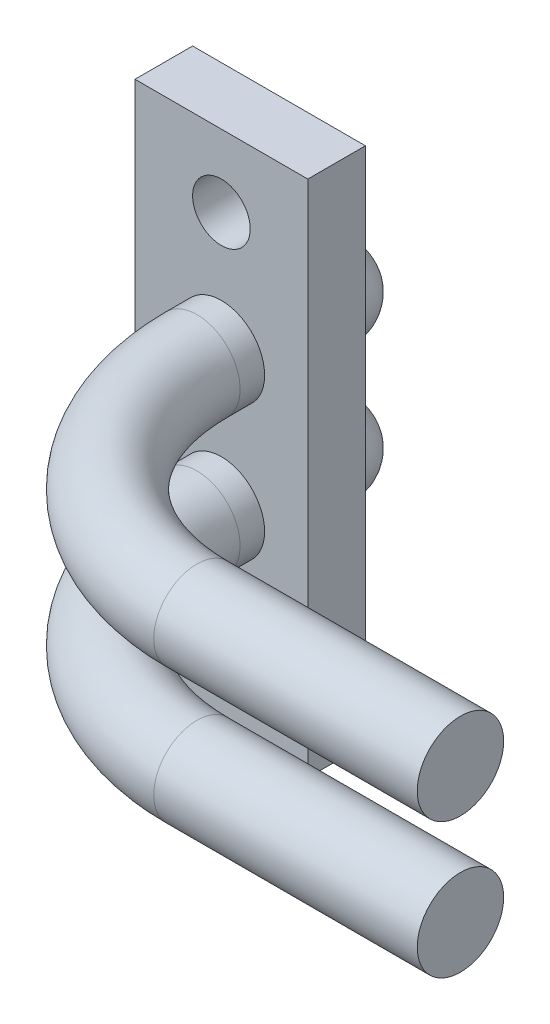
ISO-10303-21;
HEADER;
FILE_DESCRIPTION(('STEP AP214'),'2;1');
FILE_NAME('part.step','',(''),(''),'','','');
FILE_SCHEMA(('AUTOMOTIVE_DESIGN { 1 0 10303 214 1 1 1 1 }'));
ENDSEC;
DATA;
#1=APPLICATION_CONTEXT('core data for automotive mechanical design processes');
#2=APPLICATION_PROTOCOL_DEFINITION('international standard','automotive_design',2000,#1);
#3=PRODUCT_CONTEXT('',#1,'mechanical');
#4=PRODUCT('Part','Part','',(#3));
#5=PRODUCT_RELATED_PRODUCT_CATEGORY('part','',(#4));
#6=PRODUCT_DEFINITION_FORMATION('','',#4);
#7=PRODUCT_DEFINITION_CONTEXT('part definition',#1,'design');
#8=PRODUCT_DEFINITION('design','',#6,#7);
#9=PRODUCT_DEFINITION_SHAPE('','',#8);
#10=(LENGTH_UNIT() NAMED_UNIT(*) SI_UNIT(.MILLI.,.METRE.));
#11=(NAMED_UNIT(*) PLANE_ANGLE_UNIT() SI_UNIT($,.RADIAN.));
#12=(NAMED_UNIT(*) SI_UNIT($,.STERADIAN.) SOLID_ANGLE_UNIT());
#13=UNCERTAINTY_MEASURE_WITH_UNIT(LENGTH_MEASURE(1.E-05),#10,'distance_accuracy_value','');
#14=(GEOMETRIC_REPRESENTATION_CONTEXT(3) GLOBAL_UNCERTAINTY_ASSIGNED_CONTEXT((#13)) GLOBAL_UNIT_ASSIGNED_CONTEXT((#10,
#11,#12)) REPRESENTATION_CONTEXT('',''));
#15=CARTESIAN_POINT('',(0.,0.,0.));
#16=DIRECTION('',(0.,0.,1.));
#17=DIRECTION('',(1.,0.,0.));
#18=AXIS2_PLACEMENT_3D('',#15,#16,#17);
#19=CARTESIAN_POINT('',(3.,9.,2.));
#20=DIRECTION('',(0.,0.,-1.));
#21=DIRECTION('',(-1.,0.,0.));
#22=AXIS2_PLACEMENT_3D('',#19,#20,#21);
#23=PLANE('',#22);
#24=CARTESIAN_POINT('',(0.,-6.5,2.));
#25=DIRECTION('',(0.,0.,1.));
#26=DIRECTION('',(-1.,0.,0.));
#27=AXIS2_PLACEMENT_3D('',#24,#25,#26);
#28=CIRCLE('',#27,1.);
#29=CARTESIAN_POINT('',(-0.999999999999992,-6.5,2.));
#30=VERTEX_POINT('',#29);
#31=EDGE_CURVE('E130',#30,#30,#28,.T.);
#32=ORIENTED_EDGE('',*,*,#31,.F.);
#33=EDGE_LOOP('',(#32));
#34=FACE_BOUND('',#33,.T.);
#35=CARTESIAN_POINT('',(0.,6.5,2.));
#36=DIRECTION('',(0.,0.,1.));
#37=DIRECTION('',(1.,0.,0.));
#38=AXIS2_PLACEMENT_3D('',#35,#36,#37);
#39=CIRCLE('',#38,1.);
#40=CARTESIAN_POINT('',(1.,6.5,2.));
#41=VERTEX_POINT('',#40);
#42=EDGE_CURVE('E119',#41,#41,#39,.T.);
#43=ORIENTED_EDGE('',*,*,#42,.F.);
#44=EDGE_LOOP('',(#43));
#45=FACE_BOUND('',#44,.T.);
#46=CARTESIAN_POINT('',(0.,-2.35,2.));
#47=DIRECTION('',(0.,0.,1.));
#48=DIRECTION('',(1.,0.,0.));
#49=AXIS2_PLACEMENT_3D('',#46,#47,#48);
#50=CIRCLE('',#49,1.5);
#51=CARTESIAN_POINT('',(1.5,-2.35,2.));
#52=VERTEX_POINT('',#51);
#53=EDGE_CURVE('E41',#52,#52,#50,.T.);
#54=ORIENTED_EDGE('',*,*,#53,.F.);
#55=EDGE_LOOP('',(#54));
#56=FACE_BOUND('',#55,.T.);
#57=DIRECTION('',(0.,1.,0.));
#58=VECTOR('',#57,1.);
#59=CARTESIAN_POINT('',(3.,-9.,2.));
#60=LINE('',#59,#58);
#61=CARTESIAN_POINT('',(3.,-9.,2.));
#62=VERTEX_POINT('',#61);
#63=CARTESIAN_POINT('',(3.,9.,2.));
#64=VERTEX_POINT('',#63);
#65=EDGE_CURVE('E86',#62,#64,#60,.T.);
#66=ORIENTED_EDGE('',*,*,#65,.T.);
#67=DIRECTION('',(-1.,0.,0.));
#68=VECTOR('',#67,1.);
#69=CARTESIAN_POINT('',(-3.,9.,2.));
#70=LINE('',#69,#68);
#71=CARTESIAN_POINT('',(-3.,9.,2.));
#72=VERTEX_POINT('',#71);
#73=EDGE_CURVE('E81',#64,#72,#70,.T.);
#74=ORIENTED_EDGE('',*,*,#73,.T.);
#75=DIRECTION('',(0.,-1.,0.));
#76=VECTOR('',#75,1.);
#77=CARTESIAN_POINT('',(-3.,-9.,2.));
#78=LINE('',#77,#76);
#79=CARTESIAN_POINT('',(-3.,-9.,2.));
#80=VERTEX_POINT('',#79);
#81=EDGE_CURVE('E84',#72,#80,#78,.T.);
#82=ORIENTED_EDGE('',*,*,#81,.T.);
#83=DIRECTION('',(1.,0.,0.));
#84=VECTOR('',#83,1.);
#85=CARTESIAN_POINT('',(-3.,-9.,2.));
#86=LINE('',#85,#84);
#87=EDGE_CURVE('E50',#80,#62,#86,.T.);
#88=ORIENTED_EDGE('',*,*,#87,.T.);
#89=EDGE_LOOP('',(#66,#74,#82,#88));
#90=FACE_BOUND('',#89,.T.);
#91=CARTESIAN_POINT('',(0.,2.35,2.));
#92=DIRECTION('',(0.,0.,1.));
#93=DIRECTION('',(1.,0.,0.));
#94=AXIS2_PLACEMENT_3D('',#91,#92,#93);
#95=CIRCLE('',#94,1.5);
#96=CARTESIAN_POINT('',(1.5,2.35,2.));
#97=VERTEX_POINT('',#96);
#98=EDGE_CURVE('E11',#97,#97,#95,.T.);
#99=ORIENTED_EDGE('',*,*,#98,.F.);
#100=EDGE_LOOP('',(#99));
#101=FACE_BOUND('',#100,.T.);
#102=ADVANCED_FACE('F31',(#34,#45,#56,#90,#101),#23,.F.);
#103=CARTESIAN_POINT('',(3.,9.,0.));
#104=DIRECTION('',(0.,0.,-1.));
#105=DIRECTION('',(-1.,0.,0.));
#106=AXIS2_PLACEMENT_3D('',#103,#104,#105);
#107=PLANE('',#106);
#108=CARTESIAN_POINT('',(0.,-6.5,0.));
#109=DIRECTION('',(0.,0.,-1.));
#110=DIRECTION('',(-1.,0.,0.));
#111=AXIS2_PLACEMENT_3D('',#108,#109,#110);
#112=CIRCLE('',#111,1.);
#113=CARTESIAN_POINT('',(-0.999999999999992,-6.5,0.));
#114=VERTEX_POINT('',#113);
#115=EDGE_CURVE('E35',#114,#114,#112,.T.);
#116=ORIENTED_EDGE('',*,*,#115,.F.);
#117=EDGE_LOOP('',(#116));
#118=FACE_BOUND('',#117,.T.);
#119=CARTESIAN_POINT('',(0.,6.5,0.));
#120=DIRECTION('',(0.,0.,-1.));
#121=DIRECTION('',(-1.,0.,0.));
#122=AXIS2_PLACEMENT_3D('',#119,#120,#121);
#123=CIRCLE('',#122,1.);
#124=CARTESIAN_POINT('',(-1.,6.5,0.));
#125=VERTEX_POINT('',#124);
#126=EDGE_CURVE('E116',#125,#125,#123,.T.);
#127=ORIENTED_EDGE('',*,*,#126,.F.);
#128=EDGE_LOOP('',(#127));
#129=FACE_BOUND('',#128,.T.);
#130=CARTESIAN_POINT('',(0.,2.35,0.));
#131=DIRECTION('',(0.,0.,-1.));
#132=DIRECTION('',(-1.,0.,0.));
#133=AXIS2_PLACEMENT_3D('',#130,#131,#132);
#134=CIRCLE('',#133,1.5);
#135=CARTESIAN_POINT('',(-1.5,2.35,0.));
#136=VERTEX_POINT('',#135);
#137=EDGE_CURVE('E104',#136,#136,#134,.T.);
#138=ORIENTED_EDGE('',*,*,#137,.F.);
#139=EDGE_LOOP('',(#138));
#140=FACE_BOUND('',#139,.T.);
#141=DIRECTION('',(0.,1.,0.));
#142=VECTOR('',#141,1.);
#143=CARTESIAN_POINT('',(3.,-9.,0.));
#144=LINE('',#143,#142);
#145=CARTESIAN_POINT('',(3.,-9.,0.));
#146=VERTEX_POINT('',#145);
#147=CARTESIAN_POINT('',(3.,9.,0.));
#148=VERTEX_POINT('',#147);
#149=EDGE_CURVE('E101',#146,#148,#144,.T.);
#150=ORIENTED_EDGE('',*,*,#149,.F.);
#151=DIRECTION('',(1.,0.,0.));
#152=VECTOR('',#151,1.);
#153=CARTESIAN_POINT('',(-3.,-9.,0.));
#154=LINE('',#153,#152);
#155=CARTESIAN_POINT('',(-3.,-9.,0.));
#156=VERTEX_POINT('',#155);
#157=EDGE_CURVE('E73',#156,#146,#154,.T.);
#158=ORIENTED_EDGE('',*,*,#157,.F.);
#159=DIRECTION('',(0.,-1.,0.));
#160=VECTOR('',#159,1.);
#161=CARTESIAN_POINT('',(-3.,-9.,0.));
#162=LINE('',#161,#160);
#163=CARTESIAN_POINT('',(-3.,9.,0.));
#164=VERTEX_POINT('',#163);
#165=EDGE_CURVE('E67',#164,#156,#162,.T.);
#166=ORIENTED_EDGE('',*,*,#165,.F.);
#167=DIRECTION('',(-1.,0.,0.));
#168=VECTOR('',#167,1.);
#169=CARTESIAN_POINT('',(-3.,9.,0.));
#170=LINE('',#169,#168);
#171=EDGE_CURVE('E91',#148,#164,#170,.T.);
#172=ORIENTED_EDGE('',*,*,#171,.F.);
#173=EDGE_LOOP('',(#150,#158,#166,#172));
#174=FACE_BOUND('',#173,.T.);
#175=CARTESIAN_POINT('',(0.,-2.35,0.));
#176=DIRECTION('',(0.,0.,-1.));
#177=DIRECTION('',(-1.,0.,0.));
#178=AXIS2_PLACEMENT_3D('',#175,#176,#177);
#179=CIRCLE('',#178,1.5);
#180=CARTESIAN_POINT('',(-1.5,-2.35,0.));
#181=VERTEX_POINT('',#180);
#182=EDGE_CURVE('E149',#181,#181,#179,.T.);
#183=ORIENTED_EDGE('',*,*,#182,.F.);
#184=EDGE_LOOP('',(#183));
#185=FACE_BOUND('',#184,.T.);
#186=ADVANCED_FACE('F157',(#118,#129,#140,#174,#185),#107,.T.);
#187=CARTESIAN_POINT('',(3.,-9.,2.));
#188=DIRECTION('',(-1.,0.,0.));
#189=DIRECTION('',(0.,0.,1.));
#190=AXIS2_PLACEMENT_3D('',#187,#188,#189);
#191=PLANE('',#190);
#192=ORIENTED_EDGE('',*,*,#149,.T.);
#193=DIRECTION('',(0.,0.,-1.));
#194=VECTOR('',#193,1.);
#195=CARTESIAN_POINT('',(3.,9.,2.));
#196=LINE('',#195,#194);
#197=EDGE_CURVE('E92',#64,#148,#196,.T.);
#198=ORIENTED_EDGE('',*,*,#197,.F.);
#199=ORIENTED_EDGE('',*,*,#65,.F.);
#200=DIRECTION('',(0.,0.,-1.));
#201=VECTOR('',#200,1.);
#202=CARTESIAN_POINT('',(3.,-9.,2.));
#203=LINE('',#202,#201);
#204=EDGE_CURVE('E97',#62,#146,#203,.T.);
#205=ORIENTED_EDGE('',*,*,#204,.T.);
#206=EDGE_LOOP('',(#192,#198,#199,#205));
#207=FACE_BOUND('',#206,.T.);
#208=ADVANCED_FACE('F160',(#207),#191,.F.);
#209=CARTESIAN_POINT('',(-3.,9.,2.));
#210=DIRECTION('',(0.,-1.,0.));
#211=DIRECTION('',(0.,0.,-1.));
#212=AXIS2_PLACEMENT_3D('',#209,#210,#211);
#213=PLANE('',#212);
#214=ORIENTED_EDGE('',*,*,#171,.T.);
#215=DIRECTION('',(0.,0.,-1.));
#216=VECTOR('',#215,1.);
#217=CARTESIAN_POINT('',(-3.,9.,2.));
#218=LINE('',#217,#216);
#219=EDGE_CURVE('E89',#72,#164,#218,.T.);
#220=ORIENTED_EDGE('',*,*,#219,.F.);
#221=ORIENTED_EDGE('',*,*,#73,.F.);
#222=ORIENTED_EDGE('',*,*,#197,.T.);
#223=EDGE_LOOP('',(#214,#220,#221,#222));
#224=FACE_BOUND('',#223,.T.);
#225=ADVANCED_FACE('F90',(#224),#213,.F.);
#226=CARTESIAN_POINT('',(-3.,-9.,2.));
#227=DIRECTION('',(1.,0.,0.));
#228=DIRECTION('',(0.,0.,-1.));
#229=AXIS2_PLACEMENT_3D('',#226,#227,#228);
#230=PLANE('',#229);
#231=ORIENTED_EDGE('',*,*,#165,.T.);
#232=DIRECTION('',(0.,0.,-1.));
#233=VECTOR('',#232,1.);
#234=CARTESIAN_POINT('',(-3.,-9.,2.));
#235=LINE('',#234,#233);
#236=EDGE_CURVE('E93',#80,#156,#235,.T.);
#237=ORIENTED_EDGE('',*,*,#236,.F.);
#238=ORIENTED_EDGE('',*,*,#81,.F.);
#239=ORIENTED_EDGE('',*,*,#219,.T.);
#240=EDGE_LOOP('',(#231,#237,#238,#239));
#241=FACE_BOUND('',#240,.T.);
#242=ADVANCED_FACE('F95',(#241),#230,.F.);
#243=CARTESIAN_POINT('',(-3.,-9.,2.));
#244=DIRECTION('',(0.,1.,0.));
#245=DIRECTION('',(0.,0.,1.));
#246=AXIS2_PLACEMENT_3D('',#243,#244,#245);
#247=PLANE('',#246);
#248=ORIENTED_EDGE('',*,*,#157,.T.);
#249=ORIENTED_EDGE('',*,*,#204,.F.);
#250=ORIENTED_EDGE('',*,*,#87,.F.);
#251=ORIENTED_EDGE('',*,*,#236,.T.);
#252=EDGE_LOOP('',(#248,#249,#250,#251));
#253=FACE_BOUND('',#252,.T.);
#254=ADVANCED_FACE('F177',(#253),#247,.F.);
#255=CARTESIAN_POINT('',(0.,2.35,-3.));
#256=DIRECTION('',(0.,0.,1.));
#257=DIRECTION('',(1.,0.,0.));
#258=AXIS2_PLACEMENT_3D('',#255,#256,#257);
#259=CYLINDRICAL_SURFACE('',#258,1.5);
#260=CARTESIAN_POINT('',(0.,2.35,-1.5));
#261=DIRECTION('',(0.,0.,1.));
#262=DIRECTION('',(1.,0.,0.));
#263=AXIS2_PLACEMENT_3D('',#260,#261,#262);
#264=CIRCLE('',#263,1.5);
#265=CARTESIAN_POINT('',(1.5,2.35,-1.5));
#266=VERTEX_POINT('',#265);
#267=EDGE_CURVE('E114',#266,#266,#264,.T.);
#268=ORIENTED_EDGE('',*,*,#267,.T.);
#269=EDGE_LOOP('',(#268));
#270=FACE_BOUND('',#269,.T.);
#271=ORIENTED_EDGE('',*,*,#137,.T.);
#272=EDGE_LOOP('',(#271));
#273=FACE_BOUND('',#272,.T.);
#274=ADVANCED_FACE('F155',(#270,#273),#259,.T.);
#275=CARTESIAN_POINT('',(0.,-2.35,-3.));
#276=DIRECTION('',(0.,0.,1.));
#277=DIRECTION('',(1.,0.,0.));
#278=AXIS2_PLACEMENT_3D('',#275,#276,#277);
#279=CYLINDRICAL_SURFACE('',#278,1.5);
#280=CARTESIAN_POINT('',(0.,-2.35,-1.5));
#281=DIRECTION('',(0.,0.,1.));
#282=DIRECTION('',(1.,0.,0.));
#283=AXIS2_PLACEMENT_3D('',#280,#281,#282);
#284=CIRCLE('',#283,1.5);
#285=CARTESIAN_POINT('',(1.5,-2.35,-1.5));
#286=VERTEX_POINT('',#285);
#287=EDGE_CURVE('E111',#286,#286,#284,.T.);
#288=ORIENTED_EDGE('',*,*,#287,.T.);
#289=EDGE_LOOP('',(#288));
#290=FACE_BOUND('',#289,.T.);
#291=ORIENTED_EDGE('',*,*,#182,.T.);
#292=EDGE_LOOP('',(#291));
#293=FACE_BOUND('',#292,.T.);
#294=ADVANCED_FACE('F167',(#290,#293),#279,.T.);
#295=CARTESIAN_POINT('',(0.,-2.35,-1.5));
#296=DIRECTION('',(0.,0.,1.));
#297=DIRECTION('',(1.,0.,0.));
#298=AXIS2_PLACEMENT_3D('',#295,#296,#297);
#299=SPHERICAL_SURFACE('',#298,1.5);
#300=ORIENTED_EDGE('',*,*,#287,.F.);
#301=EDGE_LOOP('',(#300));
#302=FACE_BOUND('',#301,.T.);
#303=ADVANCED_FACE('F169',(#302),#299,.T.);
#304=CARTESIAN_POINT('',(0.,2.35,-1.5));
#305=DIRECTION('',(0.,0.,1.));
#306=DIRECTION('',(1.,0.,0.));
#307=AXIS2_PLACEMENT_3D('',#304,#305,#306);
#308=SPHERICAL_SURFACE('',#307,1.5);
#309=ORIENTED_EDGE('',*,*,#267,.F.);
#310=EDGE_LOOP('',(#309));
#311=FACE_BOUND('',#310,.T.);
#312=ADVANCED_FACE('F33',(#311),#308,.T.);
#313=CARTESIAN_POINT('',(7.5,-2.35,10.35));
#314=DIRECTION('',(1.,0.,0.));
#315=DIRECTION('',(0.,0.,-1.));
#316=AXIS2_PLACEMENT_3D('',#313,#314,#315);
#317=CYLINDRICAL_SURFACE('',#316,1.5);
#318=CARTESIAN_POINT('',(7.5,-2.35,10.35));
#319=DIRECTION('',(1.,0.,0.));
#320=DIRECTION('',(0.,0.,-1.));
#321=AXIS2_PLACEMENT_3D('',#318,#319,#320);
#322=CIRCLE('',#321,1.5);
#323=CARTESIAN_POINT('',(7.5,-2.35,11.85));
#324=VERTEX_POINT('',#323);
#325=EDGE_CURVE('E141',#324,#324,#322,.T.);
#326=ORIENTED_EDGE('',*,*,#325,.T.);
#327=EDGE_LOOP('',(#326));
#328=FACE_BOUND('',#327,.T.);
#329=CARTESIAN_POINT('',(16.65,-2.35,10.35));
#330=DIRECTION('',(1.,0.,0.));
#331=DIRECTION('',(0.,0.,-1.));
#332=AXIS2_PLACEMENT_3D('',#329,#330,#331);
#333=CIRCLE('',#332,1.5);
#334=CARTESIAN_POINT('',(16.65,-2.35,8.85));
#335=VERTEX_POINT('',#334);
#336=EDGE_CURVE('E146',#335,#335,#333,.T.);
#337=ORIENTED_EDGE('',*,*,#336,.F.);
#338=EDGE_LOOP('',(#337));
#339=FACE_BOUND('',#338,.T.);
#340=ADVANCED_FACE('F237',(#328,#339),#317,.T.);
#341=CARTESIAN_POINT('',(7.5,-2.35,2.85));
#342=DIRECTION('',(0.,1.,0.));
#343=DIRECTION('',(0.,0.,1.));
#344=AXIS2_PLACEMENT_3D('',#341,#342,#343);
#345=TOROIDAL_SURFACE('',#344,7.5,1.5);
#346=CARTESIAN_POINT('',(0.,-2.35,2.85));
#347=DIRECTION('',(0.,0.,1.));
#348=DIRECTION('',(1.,0.,0.));
#349=AXIS2_PLACEMENT_3D('',#346,#347,#348);
#350=CIRCLE('',#349,1.5);
#351=CARTESIAN_POINT('',(-1.5,-2.35,2.85));
#352=VERTEX_POINT('',#351);
#353=EDGE_CURVE('E138',#352,#352,#350,.T.);
#354=CARTESIAN_POINT('',(7.5,-2.35,2.85));
#355=DIRECTION('',(0.,1.,0.));
#356=DIRECTION('',(0.,0.,1.));
#357=AXIS2_PLACEMENT_3D('',#354,#355,#356);
#358=CIRCLE('',#357,9.);
#359=EDGE_CURVE('',#352,#324,#358,.T.);
#360=ORIENTED_EDGE('',*,*,#353,.T.);
#361=ORIENTED_EDGE('',*,*,#325,.F.);
#362=ORIENTED_EDGE('',*,*,#359,.T.);
#363=ORIENTED_EDGE('',*,*,#359,.F.);
#364=EDGE_LOOP('',(#360,#362,#361,#363));
#365=FACE_BOUND('',#364,.T.);
#366=ADVANCED_FACE('F247',(#365),#345,.T.);
#367=CARTESIAN_POINT('',(0.,-2.35,2.85));
#368=DIRECTION('',(0.,0.,-1.));
#369=DIRECTION('',(-1.,0.,0.));
#370=AXIS2_PLACEMENT_3D('',#367,#368,#369);
#371=CYLINDRICAL_SURFACE('',#370,1.5);
#372=ORIENTED_EDGE('',*,*,#353,.F.);
#373=EDGE_LOOP('',(#372));
#374=FACE_BOUND('',#373,.T.);
#375=ORIENTED_EDGE('',*,*,#53,.T.);
#376=EDGE_LOOP('',(#375));
#377=FACE_BOUND('',#376,.T.);
#378=ADVANCED_FACE('F256',(#374,#377),#371,.T.);
#379=CARTESIAN_POINT('',(16.65,-2.35,10.35));
#380=DIRECTION('',(1.,0.,0.));
#381=DIRECTION('',(0.,0.,-1.));
#382=AXIS2_PLACEMENT_3D('',#379,#380,#381);
#383=PLANE('',#382);
#384=ORIENTED_EDGE('',*,*,#336,.T.);
#385=EDGE_LOOP('',(#384));
#386=FACE_BOUND('',#385,.T.);
#387=ADVANCED_FACE('F266',(#386),#383,.T.);
#388=CARTESIAN_POINT('',(7.5,2.35,10.35));
#389=DIRECTION('',(1.,0.,0.));
#390=DIRECTION('',(0.,0.,-1.));
#391=AXIS2_PLACEMENT_3D('',#388,#389,#390);
#392=CYLINDRICAL_SURFACE('',#391,1.5);
#393=CARTESIAN_POINT('',(7.5,2.35,10.35));
#394=DIRECTION('',(1.,0.,0.));
#395=DIRECTION('',(0.,0.,-1.));
#396=AXIS2_PLACEMENT_3D('',#393,#394,#395);
#397=CIRCLE('',#396,1.5);
#398=CARTESIAN_POINT('',(7.5,2.35,11.85));
#399=VERTEX_POINT('',#398);
#400=EDGE_CURVE('E123',#399,#399,#397,.T.);
#401=ORIENTED_EDGE('',*,*,#400,.T.);
#402=EDGE_LOOP('',(#401));
#403=FACE_BOUND('',#402,.T.);
#404=CARTESIAN_POINT('',(16.65,2.35,10.35));
#405=DIRECTION('',(1.,0.,0.));
#406=DIRECTION('',(0.,0.,-1.));
#407=AXIS2_PLACEMENT_3D('',#404,#405,#406);
#408=CIRCLE('',#407,1.5);
#409=CARTESIAN_POINT('',(16.65,2.35,8.85));
#410=VERTEX_POINT('',#409);
#411=EDGE_CURVE('E135',#410,#410,#408,.T.);
#412=ORIENTED_EDGE('',*,*,#411,.F.);
#413=EDGE_LOOP('',(#412));
#414=FACE_BOUND('',#413,.T.);
#415=ADVANCED_FACE('F276',(#403,#414),#392,.T.);
#416=CARTESIAN_POINT('',(7.5,2.35,2.85));
#417=DIRECTION('',(0.,1.,0.));
#418=DIRECTION('',(0.,0.,1.));
#419=AXIS2_PLACEMENT_3D('',#416,#417,#418);
#420=TOROIDAL_SURFACE('',#419,7.5,1.5);
#421=CARTESIAN_POINT('',(0.,2.35,2.85));
#422=DIRECTION('',(0.,0.,1.));
#423=DIRECTION('',(1.,0.,0.));
#424=AXIS2_PLACEMENT_3D('',#421,#422,#423);
#425=CIRCLE('',#424,1.5);
#426=CARTESIAN_POINT('',(-1.5,2.35,2.85));
#427=VERTEX_POINT('',#426);
#428=EDGE_CURVE('E118',#427,#427,#425,.T.);
#429=CARTESIAN_POINT('',(7.5,2.35,2.85));
#430=DIRECTION('',(0.,1.,0.));
#431=DIRECTION('',(0.,0.,1.));
#432=AXIS2_PLACEMENT_3D('',#429,#430,#431);
#433=CIRCLE('',#432,9.);
#434=EDGE_CURVE('',#427,#399,#433,.T.);
#435=ORIENTED_EDGE('',*,*,#428,.T.);
#436=ORIENTED_EDGE('',*,*,#400,.F.);
#437=ORIENTED_EDGE('',*,*,#434,.T.);
#438=ORIENTED_EDGE('',*,*,#434,.F.);
#439=EDGE_LOOP('',(#435,#437,#436,#438));
#440=FACE_BOUND('',#439,.T.);
#441=ADVANCED_FACE('F286',(#440),#420,.T.);
#442=CARTESIAN_POINT('',(0.,2.35,2.85));
#443=DIRECTION('',(0.,0.,-1.));
#444=DIRECTION('',(-1.,0.,0.));
#445=AXIS2_PLACEMENT_3D('',#442,#443,#444);
#446=CYLINDRICAL_SURFACE('',#445,1.5);
#447=ORIENTED_EDGE('',*,*,#428,.F.);
#448=EDGE_LOOP('',(#447));
#449=FACE_BOUND('',#448,.T.);
#450=ORIENTED_EDGE('',*,*,#98,.T.);
#451=EDGE_LOOP('',(#450));
#452=FACE_BOUND('',#451,.T.);
#453=ADVANCED_FACE('F296',(#449,#452),#446,.T.);
#454=CARTESIAN_POINT('',(16.65,2.35,10.35));
#455=DIRECTION('',(1.,0.,0.));
#456=DIRECTION('',(0.,0.,-1.));
#457=AXIS2_PLACEMENT_3D('',#454,#455,#456);
#458=PLANE('',#457);
#459=ORIENTED_EDGE('',*,*,#411,.T.);
#460=EDGE_LOOP('',(#459));
#461=FACE_BOUND('',#460,.T.);
#462=ADVANCED_FACE('F306',(#461),#458,.T.);
#463=CARTESIAN_POINT('',(0.,6.5,-3.));
#464=DIRECTION('',(0.,0.,1.));
#465=DIRECTION('',(1.,0.,0.));
#466=AXIS2_PLACEMENT_3D('',#463,#464,#465);
#467=CYLINDRICAL_SURFACE('',#466,1.);
#468=ORIENTED_EDGE('',*,*,#126,.T.);
#469=EDGE_LOOP('',(#468));
#470=FACE_BOUND('',#469,.T.);
#471=ORIENTED_EDGE('',*,*,#42,.T.);
#472=EDGE_LOOP('',(#471));
#473=FACE_BOUND('',#472,.T.);
#474=ADVANCED_FACE('F315',(#470,#473),#467,.F.);
#475=CARTESIAN_POINT('',(0.,-6.5,-3.));
#476=DIRECTION('',(0.,0.,1.));
#477=DIRECTION('',(1.,0.,0.));
#478=AXIS2_PLACEMENT_3D('',#475,#476,#477);
#479=CYLINDRICAL_SURFACE('',#478,1.);
#480=ORIENTED_EDGE('',*,*,#115,.T.);
#481=EDGE_LOOP('',(#480));
#482=FACE_BOUND('',#481,.T.);
#483=ORIENTED_EDGE('',*,*,#31,.T.);
#484=EDGE_LOOP('',(#483));
#485=FACE_BOUND('',#484,.T.);
#486=ADVANCED_FACE('F332',(#482,#485),#479,.F.);
#487=CLOSED_SHELL('',(#102,#186,#208,#225,#242,#254,#274,#294,#303,#312,#340,#366,#378,#387,
#415,#441,#453,#462,#474,#486));
#488=MANIFOLD_SOLID_BREP('B2',#487);
#489=ADVANCED_BREP_SHAPE_REPRESENTATION('',(#18,#488),#14);
#490=SHAPE_DEFINITION_REPRESENTATION(#9,#489);
ENDSEC;
END-ISO-10303-21;
